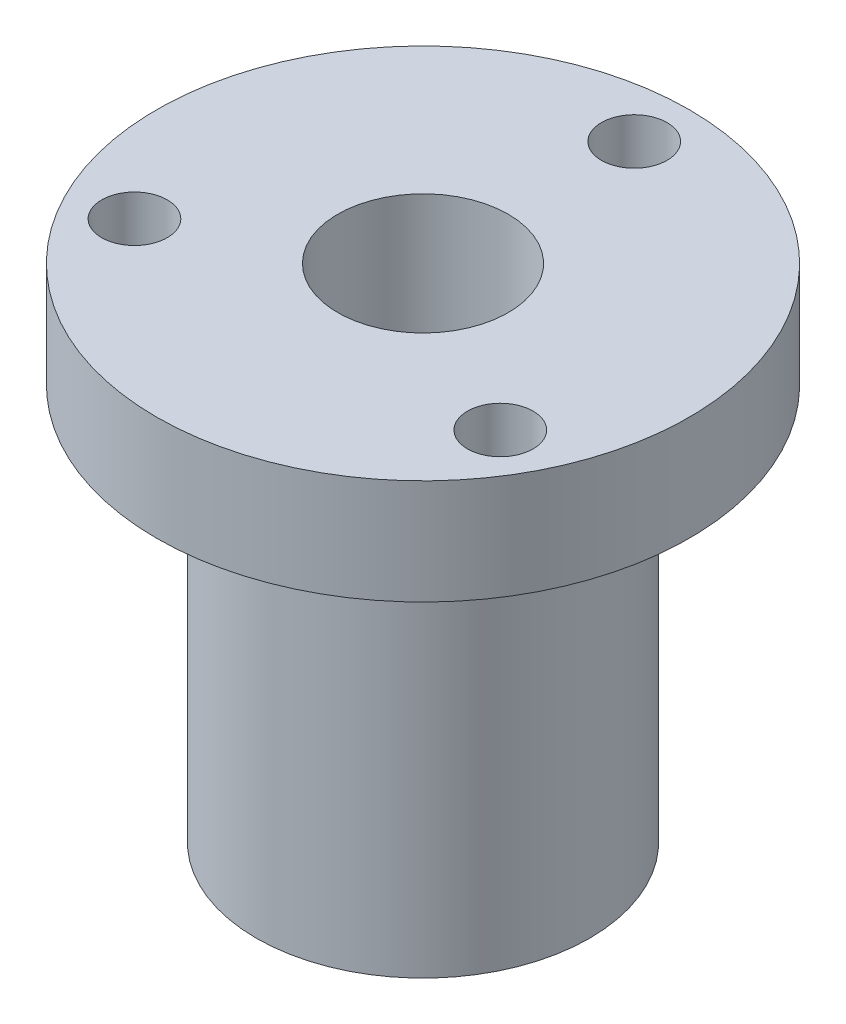
ISO-10303-21;
HEADER;
FILE_DESCRIPTION(('STEP AP214'),'2;1');
FILE_NAME('part.step','',(''),(''),'','','');
FILE_SCHEMA(('AUTOMOTIVE_DESIGN { 1 0 10303 214 1 1 1 1 }'));
ENDSEC;
DATA;
#1=APPLICATION_CONTEXT('core data for automotive mechanical design processes');
#2=APPLICATION_PROTOCOL_DEFINITION('international standard','automotive_design',2000,#1);
#3=PRODUCT_CONTEXT('',#1,'mechanical');
#4=PRODUCT('Part','Part','',(#3));
#5=PRODUCT_RELATED_PRODUCT_CATEGORY('part','',(#4));
#6=PRODUCT_DEFINITION_FORMATION('','',#4);
#7=PRODUCT_DEFINITION_CONTEXT('part definition',#1,'design');
#8=PRODUCT_DEFINITION('design','',#6,#7);
#9=PRODUCT_DEFINITION_SHAPE('','',#8);
#10=(LENGTH_UNIT() NAMED_UNIT(*) SI_UNIT(.MILLI.,.METRE.));
#11=(NAMED_UNIT(*) PLANE_ANGLE_UNIT() SI_UNIT($,.RADIAN.));
#12=(NAMED_UNIT(*) SI_UNIT($,.STERADIAN.) SOLID_ANGLE_UNIT());
#13=UNCERTAINTY_MEASURE_WITH_UNIT(LENGTH_MEASURE(1.E-05),#10,'distance_accuracy_value','');
#14=(GEOMETRIC_REPRESENTATION_CONTEXT(3) GLOBAL_UNCERTAINTY_ASSIGNED_CONTEXT((#13)) GLOBAL_UNIT_ASSIGNED_CONTEXT((#10,
#11,#12)) REPRESENTATION_CONTEXT('',''));
#15=CARTESIAN_POINT('',(0.,0.,0.));
#16=DIRECTION('',(0.,0.,1.));
#17=DIRECTION('',(1.,0.,0.));
#18=AXIS2_PLACEMENT_3D('',#15,#16,#17);
#19=CARTESIAN_POINT('',(3.25,0.,0.));
#20=DIRECTION('',(0.,-1.,0.));
#21=DIRECTION('',(0.,0.,-1.));
#22=AXIS2_PLACEMENT_3D('',#19,#20,#21);
#23=PLANE('',#22);
#24=CARTESIAN_POINT('',(0.,0.,0.));
#25=DIRECTION('',(0.,-1.,0.));
#26=DIRECTION('',(0.,0.,-1.));
#27=AXIS2_PLACEMENT_3D('',#24,#25,#26);
#28=CIRCLE('',#27,6.35);
#29=CARTESIAN_POINT('',(0.,0.,-6.35));
#30=VERTEX_POINT('',#29);
#31=EDGE_CURVE('E12',#30,#30,#28,.T.);
#32=ORIENTED_EDGE('',*,*,#31,.T.);
#33=EDGE_LOOP('',(#32));
#34=FACE_BOUND('',#33,.T.);
#35=CARTESIAN_POINT('',(0.,0.,0.));
#36=DIRECTION('',(0.,-1.,0.));
#37=DIRECTION('',(0.,0.,-1.));
#38=AXIS2_PLACEMENT_3D('',#35,#36,#37);
#39=CIRCLE('',#38,3.25);
#40=CARTESIAN_POINT('',(0.,0.,-3.25));
#41=VERTEX_POINT('',#40);
#42=EDGE_CURVE('E68',#41,#41,#39,.T.);
#43=ORIENTED_EDGE('',*,*,#42,.F.);
#44=EDGE_LOOP('',(#43));
#45=FACE_BOUND('',#44,.T.);
#46=ADVANCED_FACE('F46',(#34,#45),#23,.T.);
#47=CARTESIAN_POINT('',(0.,0.,0.));
#48=DIRECTION('',(0.,-1.,0.));
#49=DIRECTION('',(0.,0.,-1.));
#50=AXIS2_PLACEMENT_3D('',#47,#48,#49);
#51=CYLINDRICAL_SURFACE('',#50,6.35);
#52=CARTESIAN_POINT('',(0.,15.1,0.));
#53=DIRECTION('',(0.,-1.,0.));
#54=DIRECTION('',(0.,0.,-1.));
#55=AXIS2_PLACEMENT_3D('',#52,#53,#54);
#56=CIRCLE('',#55,6.35);
#57=CARTESIAN_POINT('',(0.,15.1,-6.35));
#58=VERTEX_POINT('',#57);
#59=EDGE_CURVE('E52',#58,#58,#56,.T.);
#60=ORIENTED_EDGE('',*,*,#59,.T.);
#61=EDGE_LOOP('',(#60));
#62=FACE_BOUND('',#61,.T.);
#63=ORIENTED_EDGE('',*,*,#31,.F.);
#64=EDGE_LOOP('',(#63));
#65=FACE_BOUND('',#64,.T.);
#66=ADVANCED_FACE('F114',(#62,#65),#51,.T.);
#67=CARTESIAN_POINT('',(6.35,15.1,0.));
#68=DIRECTION('',(0.,-1.,0.));
#69=DIRECTION('',(0.,0.,-1.));
#70=AXIS2_PLACEMENT_3D('',#67,#68,#69);
#71=PLANE('',#70);
#72=CARTESIAN_POINT('',(-6.97150450046471,15.1,4.02500000000004));
#73=DIRECTION('',(0.,-1.,0.));
#74=DIRECTION('',(0.,0.,-1.));
#75=AXIS2_PLACEMENT_3D('',#72,#73,#74);
#76=CIRCLE('',#75,1.25);
#77=CARTESIAN_POINT('',(-6.97150450046471,15.1,5.27500000000004));
#78=VERTEX_POINT('',#77);
#79=EDGE_CURVE('E84',#78,#78,#76,.F.);
#80=ORIENTED_EDGE('',*,*,#79,.T.);
#81=EDGE_LOOP('',(#80));
#82=FACE_BOUND('',#81,.T.);
#83=CARTESIAN_POINT('',(6.97150450046474,15.1,4.02499999999998));
#84=DIRECTION('',(0.,-1.,0.));
#85=DIRECTION('',(0.,0.,-1.));
#86=AXIS2_PLACEMENT_3D('',#83,#84,#85);
#87=CIRCLE('',#86,1.25);
#88=CARTESIAN_POINT('',(6.97150450046474,15.1,5.27499999999998));
#89=VERTEX_POINT('',#88);
#90=EDGE_CURVE('E78',#89,#89,#87,.F.);
#91=ORIENTED_EDGE('',*,*,#90,.T.);
#92=EDGE_LOOP('',(#91));
#93=FACE_BOUND('',#92,.T.);
#94=CARTESIAN_POINT('',(0.,15.1,-8.05));
#95=DIRECTION('',(0.,-1.,0.));
#96=DIRECTION('',(0.,0.,-1.));
#97=AXIS2_PLACEMENT_3D('',#94,#95,#96);
#98=CIRCLE('',#97,1.25);
#99=CARTESIAN_POINT('',(0.,15.1,-6.8));
#100=VERTEX_POINT('',#99);
#101=EDGE_CURVE('E72',#100,#100,#98,.F.);
#102=ORIENTED_EDGE('',*,*,#101,.T.);
#103=EDGE_LOOP('',(#102));
#104=FACE_BOUND('',#103,.T.);
#105=CARTESIAN_POINT('',(0.,15.1,0.));
#106=DIRECTION('',(0.,-1.,0.));
#107=DIRECTION('',(0.,0.,-1.));
#108=AXIS2_PLACEMENT_3D('',#105,#106,#107);
#109=CIRCLE('',#108,10.15);
#110=CARTESIAN_POINT('',(0.,15.1,-10.15));
#111=VERTEX_POINT('',#110);
#112=EDGE_CURVE('E56',#111,#111,#109,.T.);
#113=ORIENTED_EDGE('',*,*,#112,.T.);
#114=EDGE_LOOP('',(#113));
#115=FACE_BOUND('',#114,.T.);
#116=ORIENTED_EDGE('',*,*,#59,.F.);
#117=EDGE_LOOP('',(#116));
#118=FACE_BOUND('',#117,.T.);
#119=ADVANCED_FACE('F108',(#82,#93,#104,#115,#118),#71,.T.);
#120=CARTESIAN_POINT('',(0.,0.,0.));
#121=DIRECTION('',(0.,-1.,0.));
#122=DIRECTION('',(0.,0.,-1.));
#123=AXIS2_PLACEMENT_3D('',#120,#121,#122);
#124=CYLINDRICAL_SURFACE('',#123,10.15);
#125=CARTESIAN_POINT('',(0.,19.1,0.));
#126=DIRECTION('',(0.,-1.,0.));
#127=DIRECTION('',(0.,0.,-1.));
#128=AXIS2_PLACEMENT_3D('',#125,#126,#127);
#129=CIRCLE('',#128,10.15);
#130=CARTESIAN_POINT('',(0.,19.1,-10.15));
#131=VERTEX_POINT('',#130);
#132=EDGE_CURVE('E60',#131,#131,#129,.T.);
#133=ORIENTED_EDGE('',*,*,#132,.T.);
#134=EDGE_LOOP('',(#133));
#135=FACE_BOUND('',#134,.T.);
#136=ORIENTED_EDGE('',*,*,#112,.F.);
#137=EDGE_LOOP('',(#136));
#138=FACE_BOUND('',#137,.T.);
#139=ADVANCED_FACE('F96',(#135,#138),#124,.T.);
#140=CARTESIAN_POINT('',(10.15,19.1,0.));
#141=DIRECTION('',(0.,1.,0.));
#142=DIRECTION('',(0.,0.,1.));
#143=AXIS2_PLACEMENT_3D('',#140,#141,#142);
#144=PLANE('',#143);
#145=CARTESIAN_POINT('',(-6.97150450046471,19.1,4.02500000000004));
#146=DIRECTION('',(0.,1.,0.));
#147=DIRECTION('',(0.,0.,1.));
#148=AXIS2_PLACEMENT_3D('',#145,#146,#147);
#149=CIRCLE('',#148,1.25);
#150=CARTESIAN_POINT('',(-6.97150450046471,19.1,5.27500000000004));
#151=VERTEX_POINT('',#150);
#152=EDGE_CURVE('E81',#151,#151,#149,.T.);
#153=ORIENTED_EDGE('',*,*,#152,.F.);
#154=EDGE_LOOP('',(#153));
#155=FACE_BOUND('',#154,.T.);
#156=CARTESIAN_POINT('',(6.97150450046474,19.1,4.02499999999998));
#157=DIRECTION('',(0.,1.,0.));
#158=DIRECTION('',(0.,0.,1.));
#159=AXIS2_PLACEMENT_3D('',#156,#157,#158);
#160=CIRCLE('',#159,1.25);
#161=CARTESIAN_POINT('',(6.97150450046474,19.1,5.27499999999998));
#162=VERTEX_POINT('',#161);
#163=EDGE_CURVE('E75',#162,#162,#160,.T.);
#164=ORIENTED_EDGE('',*,*,#163,.F.);
#165=EDGE_LOOP('',(#164));
#166=FACE_BOUND('',#165,.T.);
#167=CARTESIAN_POINT('',(0.,19.1,-8.05));
#168=DIRECTION('',(0.,1.,0.));
#169=DIRECTION('',(0.,0.,1.));
#170=AXIS2_PLACEMENT_3D('',#167,#168,#169);
#171=CIRCLE('',#170,1.25);
#172=CARTESIAN_POINT('',(0.,19.1,-6.8));
#173=VERTEX_POINT('',#172);
#174=EDGE_CURVE('E71',#173,#173,#171,.T.);
#175=ORIENTED_EDGE('',*,*,#174,.F.);
#176=EDGE_LOOP('',(#175));
#177=FACE_BOUND('',#176,.T.);
#178=CARTESIAN_POINT('',(0.,19.1,0.));
#179=DIRECTION('',(0.,-1.,0.));
#180=DIRECTION('',(0.,0.,-1.));
#181=AXIS2_PLACEMENT_3D('',#178,#179,#180);
#182=CIRCLE('',#181,3.25);
#183=CARTESIAN_POINT('',(0.,19.1,-3.25));
#184=VERTEX_POINT('',#183);
#185=EDGE_CURVE('E65',#184,#184,#182,.T.);
#186=ORIENTED_EDGE('',*,*,#185,.T.);
#187=EDGE_LOOP('',(#186));
#188=FACE_BOUND('',#187,.T.);
#189=ORIENTED_EDGE('',*,*,#132,.F.);
#190=EDGE_LOOP('',(#189));
#191=FACE_BOUND('',#190,.T.);
#192=ADVANCED_FACE('F92',(#155,#166,#177,#188,#191),#144,.T.);
#193=CARTESIAN_POINT('',(0.,0.,0.));
#194=DIRECTION('',(0.,-1.,0.));
#195=DIRECTION('',(0.,0.,-1.));
#196=AXIS2_PLACEMENT_3D('',#193,#194,#195);
#197=CYLINDRICAL_SURFACE('',#196,3.25);
#198=ORIENTED_EDGE('',*,*,#42,.T.);
#199=EDGE_LOOP('',(#198));
#200=FACE_BOUND('',#199,.T.);
#201=ORIENTED_EDGE('',*,*,#185,.F.);
#202=EDGE_LOOP('',(#201));
#203=FACE_BOUND('',#202,.T.);
#204=ADVANCED_FACE('F95',(#200,#203),#197,.F.);
#205=CARTESIAN_POINT('',(0.,-0.001000000000001,-8.05));
#206=DIRECTION('',(0.,1.,0.));
#207=DIRECTION('',(0.,0.,1.));
#208=AXIS2_PLACEMENT_3D('',#205,#206,#207);
#209=CYLINDRICAL_SURFACE('',#208,1.25);
#210=CARTESIAN_POINT('',(0.,15.1,-6.8));
#211=CARTESIAN_POINT('',(0.,15.1416666666667,-6.8));
#212=CARTESIAN_POINT('',(0.,15.1833333333333,-6.8));
#213=CARTESIAN_POINT('',(0.,15.2666666666667,-6.8));
#214=CARTESIAN_POINT('',(0.,15.3083333333333,-6.8));
#215=CARTESIAN_POINT('',(0.,15.3916666666667,-6.8));
#216=CARTESIAN_POINT('',(0.,15.4333333333333,-6.8));
#217=CARTESIAN_POINT('',(0.,15.5166666666667,-6.8));
#218=CARTESIAN_POINT('',(0.,15.5583333333333,-6.8));
#219=CARTESIAN_POINT('',(0.,15.6416666666667,-6.8));
#220=CARTESIAN_POINT('',(0.,15.6833333333333,-6.8));
#221=CARTESIAN_POINT('',(0.,15.7666666666667,-6.8));
#222=CARTESIAN_POINT('',(0.,15.8083333333333,-6.8));
#223=CARTESIAN_POINT('',(0.,15.8916666666667,-6.8));
#224=CARTESIAN_POINT('',(0.,15.9333333333333,-6.8));
#225=CARTESIAN_POINT('',(0.,16.0166666666667,-6.8));
#226=CARTESIAN_POINT('',(0.,16.0583333333333,-6.8));
#227=CARTESIAN_POINT('',(0.,16.1416666666667,-6.8));
#228=CARTESIAN_POINT('',(0.,16.1833333333333,-6.8));
#229=CARTESIAN_POINT('',(0.,16.2666666666667,-6.8));
#230=CARTESIAN_POINT('',(0.,16.3083333333333,-6.8));
#231=CARTESIAN_POINT('',(0.,16.3916666666667,-6.8));
#232=CARTESIAN_POINT('',(0.,16.4333333333333,-6.8));
#233=CARTESIAN_POINT('',(0.,16.5166666666667,-6.8));
#234=CARTESIAN_POINT('',(0.,16.5583333333333,-6.8));
#235=CARTESIAN_POINT('',(0.,16.6416666666667,-6.8));
#236=CARTESIAN_POINT('',(0.,16.6833333333333,-6.8));
#237=CARTESIAN_POINT('',(0.,16.7666666666667,-6.8));
#238=CARTESIAN_POINT('',(0.,16.8083333333333,-6.8));
#239=CARTESIAN_POINT('',(0.,16.8916666666667,-6.8));
#240=CARTESIAN_POINT('',(0.,16.9333333333333,-6.8));
#241=CARTESIAN_POINT('',(0.,17.0166666666667,-6.8));
#242=CARTESIAN_POINT('',(0.,17.0583333333333,-6.8));
#243=CARTESIAN_POINT('',(0.,17.1416666666667,-6.8));
#244=CARTESIAN_POINT('',(0.,17.1833333333333,-6.8));
#245=CARTESIAN_POINT('',(0.,17.2666666666667,-6.8));
#246=CARTESIAN_POINT('',(0.,17.3083333333333,-6.8));
#247=CARTESIAN_POINT('',(0.,17.3916666666667,-6.8));
#248=CARTESIAN_POINT('',(0.,17.4333333333333,-6.8));
#249=CARTESIAN_POINT('',(0.,17.5166666666667,-6.8));
#250=CARTESIAN_POINT('',(0.,17.5583333333333,-6.8));
#251=CARTESIAN_POINT('',(0.,17.6416666666667,-6.8));
#252=CARTESIAN_POINT('',(0.,17.6833333333333,-6.8));
#253=CARTESIAN_POINT('',(0.,17.7666666666667,-6.8));
#254=CARTESIAN_POINT('',(0.,17.8083333333333,-6.8));
#255=CARTESIAN_POINT('',(0.,17.8916666666667,-6.8));
#256=CARTESIAN_POINT('',(0.,17.9333333333333,-6.8));
#257=CARTESIAN_POINT('',(0.,18.0166666666667,-6.8));
#258=CARTESIAN_POINT('',(0.,18.0583333333333,-6.8));
#259=CARTESIAN_POINT('',(0.,18.1416666666667,-6.8));
#260=CARTESIAN_POINT('',(0.,18.1833333333333,-6.8));
#261=CARTESIAN_POINT('',(0.,18.2666666666667,-6.8));
#262=CARTESIAN_POINT('',(0.,18.3083333333333,-6.8));
#263=CARTESIAN_POINT('',(0.,18.3916666666667,-6.8));
#264=CARTESIAN_POINT('',(0.,18.4333333333333,-6.8));
#265=CARTESIAN_POINT('',(0.,18.5166666666667,-6.8));
#266=CARTESIAN_POINT('',(0.,18.5583333333333,-6.8));
#267=CARTESIAN_POINT('',(0.,18.6416666666667,-6.8));
#268=CARTESIAN_POINT('',(0.,18.6833333333333,-6.8));
#269=CARTESIAN_POINT('',(0.,18.7666666666667,-6.8));
#270=CARTESIAN_POINT('',(0.,18.8083333333333,-6.8));
#271=CARTESIAN_POINT('',(0.,18.8916666666667,-6.8));
#272=CARTESIAN_POINT('',(0.,18.9333333333333,-6.8));
#273=CARTESIAN_POINT('',(0.,19.0166666666667,-6.8));
#274=CARTESIAN_POINT('',(0.,19.0583333333333,-6.8));
#275=CARTESIAN_POINT('',(0.,19.1,-6.8));
#276=B_SPLINE_CURVE_WITH_KNOTS('',3,(#210,#211,#212,#213,#214,#215,#216,#217,#218,#219,#220,
#221,#222,#223,#224,#225,#226,#227,#228,#229,#230,#231,#232,#233,#234,#235,#236,#237,#238,#239,
#240,#241,#242,#243,#244,#245,#246,#247,#248,#249,#250,#251,#252,#253,#254,#255,#256,#257,#258,
#259,#260,#261,#262,#263,#264,#265,#266,#267,#268,#269,#270,#271,#272,#273,#274,#275),
.UNSPECIFIED.,.F.,.F.,(4,2,2,2,2,2,2,2,2,2,2,2,2,2,2,2,2,2,2,2,2,2,2,2,2,2,2,2,2,2,2,2,4),(0.,
0.125,0.25,0.375,0.5,0.624999999999999,0.749999999999999,0.874999999999999,0.999999999999999,
1.125,1.25,1.375,1.5,1.625,1.75,1.875,2.,2.125,2.25,2.375,2.5,2.625,2.75,2.875,3.,3.125,3.25,
3.375,3.5,3.625,3.75,3.875,4.),.UNSPECIFIED.);
#277=EDGE_CURVE('BSEAM129',#100,#173,#276,.T.);
#278=ORIENTED_EDGE('',*,*,#101,.F.);
#279=ORIENTED_EDGE('',*,*,#174,.T.);
#280=ORIENTED_EDGE('',*,*,#277,.T.);
#281=ORIENTED_EDGE('',*,*,#277,.F.);
#282=EDGE_LOOP('',(#278,#280,#279,#281));
#283=FACE_BOUND('',#282,.T.);
#284=ADVANCED_FACE('F129',(#283),#209,.F.);
#285=CARTESIAN_POINT('',(6.97150450046474,-0.001000000000001,4.02499999999998));
#286=DIRECTION('',(0.,1.,0.));
#287=DIRECTION('',(0.,0.,1.));
#288=AXIS2_PLACEMENT_3D('',#285,#286,#287);
#289=CYLINDRICAL_SURFACE('',#288,1.25);
#290=CARTESIAN_POINT('',(6.97150450046474,15.1,5.27499999999998));
#291=CARTESIAN_POINT('',(6.97150450046474,15.1416666666667,5.27499999999998));
#292=CARTESIAN_POINT('',(6.97150450046474,15.1833333333333,5.27499999999998));
#293=CARTESIAN_POINT('',(6.97150450046474,15.2666666666667,5.27499999999998));
#294=CARTESIAN_POINT('',(6.97150450046474,15.3083333333333,5.27499999999998));
#295=CARTESIAN_POINT('',(6.97150450046474,15.3916666666667,5.27499999999998));
#296=CARTESIAN_POINT('',(6.97150450046474,15.4333333333333,5.27499999999998));
#297=CARTESIAN_POINT('',(6.97150450046474,15.5166666666667,5.27499999999998));
#298=CARTESIAN_POINT('',(6.97150450046474,15.5583333333333,5.27499999999998));
#299=CARTESIAN_POINT('',(6.97150450046474,15.6416666666667,5.27499999999998));
#300=CARTESIAN_POINT('',(6.97150450046474,15.6833333333333,5.27499999999998));
#301=CARTESIAN_POINT('',(6.97150450046474,15.7666666666667,5.27499999999998));
#302=CARTESIAN_POINT('',(6.97150450046474,15.8083333333333,5.27499999999998));
#303=CARTESIAN_POINT('',(6.97150450046474,15.8916666666667,5.27499999999998));
#304=CARTESIAN_POINT('',(6.97150450046474,15.9333333333333,5.27499999999998));
#305=CARTESIAN_POINT('',(6.97150450046474,16.0166666666667,5.27499999999998));
#306=CARTESIAN_POINT('',(6.97150450046474,16.0583333333333,5.27499999999998));
#307=CARTESIAN_POINT('',(6.97150450046474,16.1416666666667,5.27499999999998));
#308=CARTESIAN_POINT('',(6.97150450046474,16.1833333333333,5.27499999999998));
#309=CARTESIAN_POINT('',(6.97150450046474,16.2666666666667,5.27499999999998));
#310=CARTESIAN_POINT('',(6.97150450046474,16.3083333333333,5.27499999999998));
#311=CARTESIAN_POINT('',(6.97150450046474,16.3916666666667,5.27499999999998));
#312=CARTESIAN_POINT('',(6.97150450046474,16.4333333333333,5.27499999999998));
#313=CARTESIAN_POINT('',(6.97150450046474,16.5166666666667,5.27499999999998));
#314=CARTESIAN_POINT('',(6.97150450046474,16.5583333333333,5.27499999999998));
#315=CARTESIAN_POINT('',(6.97150450046474,16.6416666666667,5.27499999999998));
#316=CARTESIAN_POINT('',(6.97150450046474,16.6833333333333,5.27499999999998));
#317=CARTESIAN_POINT('',(6.97150450046474,16.7666666666667,5.27499999999998));
#318=CARTESIAN_POINT('',(6.97150450046474,16.8083333333333,5.27499999999998));
#319=CARTESIAN_POINT('',(6.97150450046474,16.8916666666667,5.27499999999998));
#320=CARTESIAN_POINT('',(6.97150450046474,16.9333333333333,5.27499999999998));
#321=CARTESIAN_POINT('',(6.97150450046474,17.0166666666667,5.27499999999998));
#322=CARTESIAN_POINT('',(6.97150450046474,17.0583333333333,5.27499999999998));
#323=CARTESIAN_POINT('',(6.97150450046474,17.1416666666667,5.27499999999998));
#324=CARTESIAN_POINT('',(6.97150450046474,17.1833333333333,5.27499999999998));
#325=CARTESIAN_POINT('',(6.97150450046474,17.2666666666667,5.27499999999998));
#326=CARTESIAN_POINT('',(6.97150450046474,17.3083333333333,5.27499999999998));
#327=CARTESIAN_POINT('',(6.97150450046474,17.3916666666667,5.27499999999998));
#328=CARTESIAN_POINT('',(6.97150450046474,17.4333333333333,5.27499999999998));
#329=CARTESIAN_POINT('',(6.97150450046474,17.5166666666667,5.27499999999998));
#330=CARTESIAN_POINT('',(6.97150450046474,17.5583333333333,5.27499999999998));
#331=CARTESIAN_POINT('',(6.97150450046474,17.6416666666667,5.27499999999998));
#332=CARTESIAN_POINT('',(6.97150450046474,17.6833333333333,5.27499999999998));
#333=CARTESIAN_POINT('',(6.97150450046474,17.7666666666667,5.27499999999998));
#334=CARTESIAN_POINT('',(6.97150450046474,17.8083333333333,5.27499999999998));
#335=CARTESIAN_POINT('',(6.97150450046474,17.8916666666667,5.27499999999998));
#336=CARTESIAN_POINT('',(6.97150450046474,17.9333333333333,5.27499999999998));
#337=CARTESIAN_POINT('',(6.97150450046474,18.0166666666667,5.27499999999998));
#338=CARTESIAN_POINT('',(6.97150450046474,18.0583333333333,5.27499999999998));
#339=CARTESIAN_POINT('',(6.97150450046474,18.1416666666667,5.27499999999998));
#340=CARTESIAN_POINT('',(6.97150450046474,18.1833333333333,5.27499999999998));
#341=CARTESIAN_POINT('',(6.97150450046474,18.2666666666667,5.27499999999998));
#342=CARTESIAN_POINT('',(6.97150450046474,18.3083333333333,5.27499999999998));
#343=CARTESIAN_POINT('',(6.97150450046474,18.3916666666667,5.27499999999998));
#344=CARTESIAN_POINT('',(6.97150450046474,18.4333333333333,5.27499999999998));
#345=CARTESIAN_POINT('',(6.97150450046474,18.5166666666667,5.27499999999998));
#346=CARTESIAN_POINT('',(6.97150450046474,18.5583333333333,5.27499999999998));
#347=CARTESIAN_POINT('',(6.97150450046474,18.6416666666667,5.27499999999998));
#348=CARTESIAN_POINT('',(6.97150450046474,18.6833333333333,5.27499999999998));
#349=CARTESIAN_POINT('',(6.97150450046474,18.7666666666667,5.27499999999998));
#350=CARTESIAN_POINT('',(6.97150450046474,18.8083333333333,5.27499999999998));
#351=CARTESIAN_POINT('',(6.97150450046474,18.8916666666667,5.27499999999998));
#352=CARTESIAN_POINT('',(6.97150450046474,18.9333333333333,5.27499999999998));
#353=CARTESIAN_POINT('',(6.97150450046474,19.0166666666667,5.27499999999998));
#354=CARTESIAN_POINT('',(6.97150450046474,19.0583333333333,5.27499999999998));
#355=CARTESIAN_POINT('',(6.97150450046474,19.1,5.27499999999998));
#356=B_SPLINE_CURVE_WITH_KNOTS('',3,(#290,#291,#292,#293,#294,#295,#296,#297,#298,#299,#300,
#301,#302,#303,#304,#305,#306,#307,#308,#309,#310,#311,#312,#313,#314,#315,#316,#317,#318,#319,
#320,#321,#322,#323,#324,#325,#326,#327,#328,#329,#330,#331,#332,#333,#334,#335,#336,#337,#338,
#339,#340,#341,#342,#343,#344,#345,#346,#347,#348,#349,#350,#351,#352,#353,#354,#355),
.UNSPECIFIED.,.F.,.F.,(4,2,2,2,2,2,2,2,2,2,2,2,2,2,2,2,2,2,2,2,2,2,2,2,2,2,2,2,2,2,2,2,4),(0.,
0.125,0.25,0.375,0.5,0.624999999999999,0.749999999999999,0.874999999999999,0.999999999999999,
1.125,1.25,1.375,1.5,1.625,1.75,1.875,2.,2.125,2.25,2.375,2.5,2.625,2.75,2.875,3.,3.125,3.25,
3.375,3.5,3.625,3.75,3.875,4.),.UNSPECIFIED.);
#357=EDGE_CURVE('BSEAM134',#89,#162,#356,.T.);
#358=ORIENTED_EDGE('',*,*,#90,.F.);
#359=ORIENTED_EDGE('',*,*,#163,.T.);
#360=ORIENTED_EDGE('',*,*,#357,.T.);
#361=ORIENTED_EDGE('',*,*,#357,.F.);
#362=EDGE_LOOP('',(#358,#360,#359,#361));
#363=FACE_BOUND('',#362,.T.);
#364=ADVANCED_FACE('F134',(#363),#289,.F.);
#365=CARTESIAN_POINT('',(-6.97150450046471,-0.001000000000001,4.02500000000004));
#366=DIRECTION('',(0.,1.,0.));
#367=DIRECTION('',(0.,0.,1.));
#368=AXIS2_PLACEMENT_3D('',#365,#366,#367);
#369=CYLINDRICAL_SURFACE('',#368,1.25);
#370=CARTESIAN_POINT('',(-6.97150450046471,15.1,5.27500000000004));
#371=CARTESIAN_POINT('',(-6.97150450046471,15.1416666666667,5.27500000000004));
#372=CARTESIAN_POINT('',(-6.97150450046471,15.1833333333333,5.27500000000004));
#373=CARTESIAN_POINT('',(-6.97150450046471,15.2666666666667,5.27500000000004));
#374=CARTESIAN_POINT('',(-6.97150450046471,15.3083333333333,5.27500000000004));
#375=CARTESIAN_POINT('',(-6.97150450046471,15.3916666666667,5.27500000000004));
#376=CARTESIAN_POINT('',(-6.97150450046471,15.4333333333333,5.27500000000004));
#377=CARTESIAN_POINT('',(-6.97150450046471,15.5166666666667,5.27500000000004));
#378=CARTESIAN_POINT('',(-6.97150450046471,15.5583333333333,5.27500000000004));
#379=CARTESIAN_POINT('',(-6.97150450046471,15.6416666666667,5.27500000000004));
#380=CARTESIAN_POINT('',(-6.97150450046471,15.6833333333333,5.27500000000004));
#381=CARTESIAN_POINT('',(-6.97150450046471,15.7666666666667,5.27500000000004));
#382=CARTESIAN_POINT('',(-6.97150450046471,15.8083333333333,5.27500000000004));
#383=CARTESIAN_POINT('',(-6.97150450046471,15.8916666666667,5.27500000000004));
#384=CARTESIAN_POINT('',(-6.97150450046471,15.9333333333333,5.27500000000004));
#385=CARTESIAN_POINT('',(-6.97150450046471,16.0166666666667,5.27500000000004));
#386=CARTESIAN_POINT('',(-6.97150450046471,16.0583333333333,5.27500000000004));
#387=CARTESIAN_POINT('',(-6.97150450046471,16.1416666666667,5.27500000000004));
#388=CARTESIAN_POINT('',(-6.97150450046471,16.1833333333333,5.27500000000004));
#389=CARTESIAN_POINT('',(-6.97150450046471,16.2666666666667,5.27500000000004));
#390=CARTESIAN_POINT('',(-6.97150450046471,16.3083333333333,5.27500000000004));
#391=CARTESIAN_POINT('',(-6.97150450046471,16.3916666666667,5.27500000000004));
#392=CARTESIAN_POINT('',(-6.97150450046471,16.4333333333333,5.27500000000004));
#393=CARTESIAN_POINT('',(-6.97150450046471,16.5166666666667,5.27500000000004));
#394=CARTESIAN_POINT('',(-6.97150450046471,16.5583333333333,5.27500000000004));
#395=CARTESIAN_POINT('',(-6.97150450046471,16.6416666666667,5.27500000000004));
#396=CARTESIAN_POINT('',(-6.97150450046471,16.6833333333333,5.27500000000004));
#397=CARTESIAN_POINT('',(-6.97150450046471,16.7666666666667,5.27500000000004));
#398=CARTESIAN_POINT('',(-6.97150450046471,16.8083333333333,5.27500000000004));
#399=CARTESIAN_POINT('',(-6.97150450046471,16.8916666666667,5.27500000000004));
#400=CARTESIAN_POINT('',(-6.97150450046471,16.9333333333333,5.27500000000004));
#401=CARTESIAN_POINT('',(-6.97150450046471,17.0166666666667,5.27500000000004));
#402=CARTESIAN_POINT('',(-6.97150450046471,17.0583333333333,5.27500000000004));
#403=CARTESIAN_POINT('',(-6.97150450046471,17.1416666666667,5.27500000000004));
#404=CARTESIAN_POINT('',(-6.97150450046471,17.1833333333333,5.27500000000004));
#405=CARTESIAN_POINT('',(-6.97150450046471,17.2666666666667,5.27500000000004));
#406=CARTESIAN_POINT('',(-6.97150450046471,17.3083333333333,5.27500000000004));
#407=CARTESIAN_POINT('',(-6.97150450046471,17.3916666666667,5.27500000000004));
#408=CARTESIAN_POINT('',(-6.97150450046471,17.4333333333333,5.27500000000004));
#409=CARTESIAN_POINT('',(-6.97150450046471,17.5166666666667,5.27500000000004));
#410=CARTESIAN_POINT('',(-6.97150450046471,17.5583333333333,5.27500000000004));
#411=CARTESIAN_POINT('',(-6.97150450046471,17.6416666666667,5.27500000000004));
#412=CARTESIAN_POINT('',(-6.97150450046471,17.6833333333333,5.27500000000004));
#413=CARTESIAN_POINT('',(-6.97150450046471,17.7666666666667,5.27500000000004));
#414=CARTESIAN_POINT('',(-6.97150450046471,17.8083333333333,5.27500000000004));
#415=CARTESIAN_POINT('',(-6.97150450046471,17.8916666666667,5.27500000000004));
#416=CARTESIAN_POINT('',(-6.97150450046471,17.9333333333333,5.27500000000004));
#417=CARTESIAN_POINT('',(-6.97150450046471,18.0166666666667,5.27500000000004));
#418=CARTESIAN_POINT('',(-6.97150450046471,18.0583333333333,5.27500000000004));
#419=CARTESIAN_POINT('',(-6.97150450046471,18.1416666666667,5.27500000000004));
#420=CARTESIAN_POINT('',(-6.97150450046471,18.1833333333333,5.27500000000004));
#421=CARTESIAN_POINT('',(-6.97150450046471,18.2666666666667,5.27500000000004));
#422=CARTESIAN_POINT('',(-6.97150450046471,18.3083333333333,5.27500000000004));
#423=CARTESIAN_POINT('',(-6.97150450046471,18.3916666666667,5.27500000000004));
#424=CARTESIAN_POINT('',(-6.97150450046471,18.4333333333333,5.27500000000004));
#425=CARTESIAN_POINT('',(-6.97150450046471,18.5166666666667,5.27500000000004));
#426=CARTESIAN_POINT('',(-6.97150450046471,18.5583333333333,5.27500000000004));
#427=CARTESIAN_POINT('',(-6.97150450046471,18.6416666666667,5.27500000000004));
#428=CARTESIAN_POINT('',(-6.97150450046471,18.6833333333333,5.27500000000004));
#429=CARTESIAN_POINT('',(-6.97150450046471,18.7666666666667,5.27500000000004));
#430=CARTESIAN_POINT('',(-6.97150450046471,18.8083333333333,5.27500000000004));
#431=CARTESIAN_POINT('',(-6.97150450046471,18.8916666666667,5.27500000000004));
#432=CARTESIAN_POINT('',(-6.97150450046471,18.9333333333333,5.27500000000004));
#433=CARTESIAN_POINT('',(-6.97150450046471,19.0166666666667,5.27500000000004));
#434=CARTESIAN_POINT('',(-6.97150450046471,19.0583333333333,5.27500000000004));
#435=CARTESIAN_POINT('',(-6.97150450046471,19.1,5.27500000000004));
#436=B_SPLINE_CURVE_WITH_KNOTS('',3,(#370,#371,#372,#373,#374,#375,#376,#377,#378,#379,#380,
#381,#382,#383,#384,#385,#386,#387,#388,#389,#390,#391,#392,#393,#394,#395,#396,#397,#398,#399,
#400,#401,#402,#403,#404,#405,#406,#407,#408,#409,#410,#411,#412,#413,#414,#415,#416,#417,#418,
#419,#420,#421,#422,#423,#424,#425,#426,#427,#428,#429,#430,#431,#432,#433,#434,#435),
.UNSPECIFIED.,.F.,.F.,(4,2,2,2,2,2,2,2,2,2,2,2,2,2,2,2,2,2,2,2,2,2,2,2,2,2,2,2,2,2,2,2,4),(0.,
0.125,0.25,0.375,0.5,0.624999999999999,0.749999999999999,0.874999999999999,0.999999999999999,
1.125,1.25,1.375,1.5,1.625,1.75,1.875,2.,2.125,2.25,2.375,2.5,2.625,2.75,2.875,3.,3.125,3.25,
3.375,3.5,3.625,3.75,3.875,4.),.UNSPECIFIED.);
#437=EDGE_CURVE('BSEAM90',#78,#151,#436,.T.);
#438=ORIENTED_EDGE('',*,*,#79,.F.);
#439=ORIENTED_EDGE('',*,*,#152,.T.);
#440=ORIENTED_EDGE('',*,*,#437,.T.);
#441=ORIENTED_EDGE('',*,*,#437,.F.);
#442=EDGE_LOOP('',(#438,#440,#439,#441));
#443=FACE_BOUND('',#442,.T.);
#444=ADVANCED_FACE('F90',(#443),#369,.F.);
#445=CLOSED_SHELL('',(#46,#66,#119,#139,#192,#204,#284,#364,#444));
#446=MANIFOLD_SOLID_BREP('B2',#445);
#447=ADVANCED_BREP_SHAPE_REPRESENTATION('',(#18,#446),#14);
#448=SHAPE_DEFINITION_REPRESENTATION(#9,#447);
ENDSEC;
END-ISO-10303-21;
